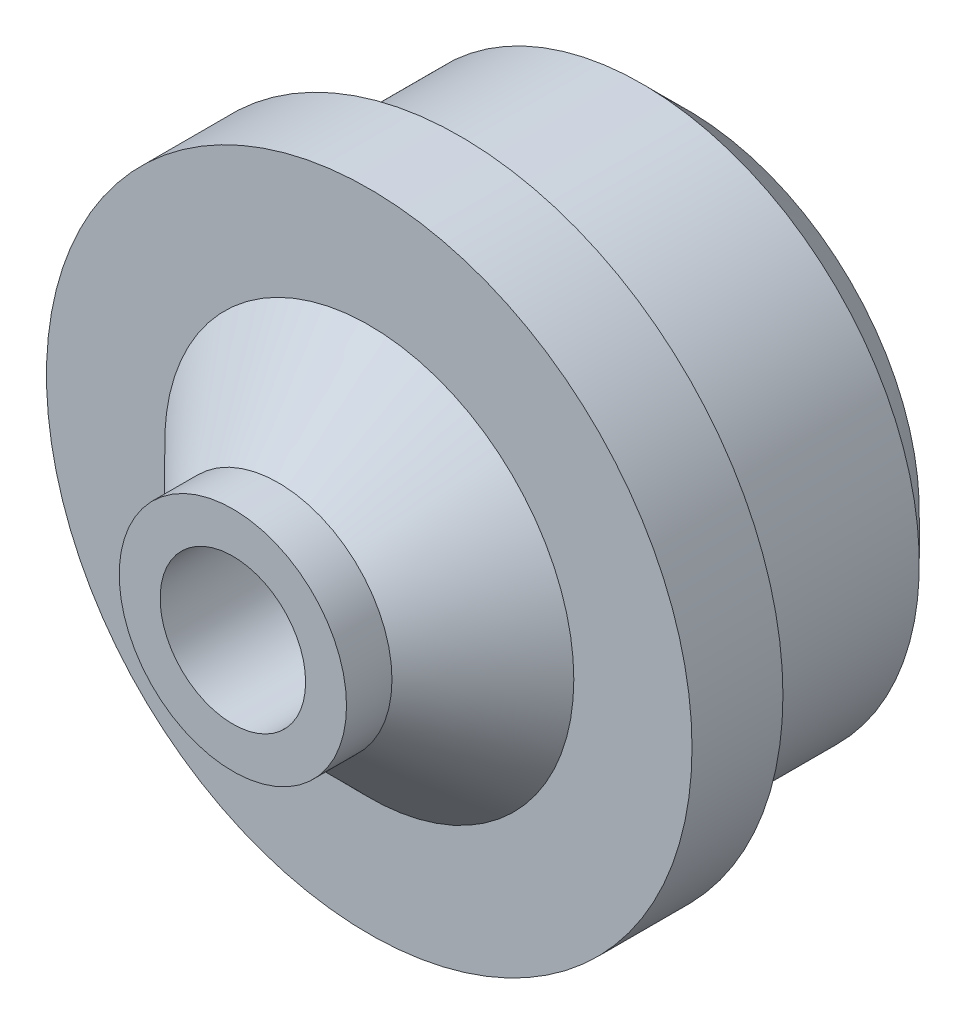
ISO-10303-21;
HEADER;
FILE_DESCRIPTION(('STEP AP214'),'2;1');
FILE_NAME('part.step','',(''),(''),'','','');
FILE_SCHEMA(('AUTOMOTIVE_DESIGN { 1 0 10303 214 1 1 1 1 }'));
ENDSEC;
DATA;
#1=APPLICATION_CONTEXT('core data for automotive mechanical design processes');
#2=APPLICATION_PROTOCOL_DEFINITION('international standard','automotive_design',2000,#1);
#3=PRODUCT_CONTEXT('',#1,'mechanical');
#4=PRODUCT('Part','Part','',(#3));
#5=PRODUCT_RELATED_PRODUCT_CATEGORY('part','',(#4));
#6=PRODUCT_DEFINITION_FORMATION('','',#4);
#7=PRODUCT_DEFINITION_CONTEXT('part definition',#1,'design');
#8=PRODUCT_DEFINITION('design','',#6,#7);
#9=PRODUCT_DEFINITION_SHAPE('','',#8);
#10=(LENGTH_UNIT() NAMED_UNIT(*) SI_UNIT(.MILLI.,.METRE.));
#11=(NAMED_UNIT(*) PLANE_ANGLE_UNIT() SI_UNIT($,.RADIAN.));
#12=(NAMED_UNIT(*) SI_UNIT($,.STERADIAN.) SOLID_ANGLE_UNIT());
#13=UNCERTAINTY_MEASURE_WITH_UNIT(LENGTH_MEASURE(1.E-05),#10,'distance_accuracy_value','');
#14=(GEOMETRIC_REPRESENTATION_CONTEXT(3) GLOBAL_UNCERTAINTY_ASSIGNED_CONTEXT((#13)) GLOBAL_UNIT_ASSIGNED_CONTEXT((#10,
#11,#12)) REPRESENTATION_CONTEXT('',''));
#15=CARTESIAN_POINT('',(0.,0.,0.));
#16=DIRECTION('',(0.,0.,1.));
#17=DIRECTION('',(1.,0.,0.));
#18=AXIS2_PLACEMENT_3D('',#15,#16,#17);
#19=CARTESIAN_POINT('',(0.,-0.874999999999985,-5.));
#20=DIRECTION('',(0.,-1.,0.));
#21=DIRECTION('',(1.,0.,0.));
#22=AXIS2_PLACEMENT_3D('',#19,#20,#21);
#23=PLANE('',#22);
#24=DIRECTION('',(1.,0.,0.));
#25=VECTOR('',#24,1.);
#26=CARTESIAN_POINT('',(0.,-0.874999999999985,0.));
#27=LINE('',#26,#25);
#28=CARTESIAN_POINT('',(-6.35,-0.875,0.));
#29=VERTEX_POINT('',#28);
#30=CARTESIAN_POINT('',(-6.03691767378022,-0.874999999999999,0.));
#31=VERTEX_POINT('',#30);
#32=EDGE_CURVE('E98',#29,#31,#27,.T.);
#33=ORIENTED_EDGE('',*,*,#32,.F.);
#34=DIRECTION('',(0.,0.,1.));
#35=VECTOR('',#34,1.);
#36=CARTESIAN_POINT('',(-6.35,-0.875,-5.));
#37=LINE('',#36,#35);
#38=CARTESIAN_POINT('',(-6.35,-0.875,-5.));
#39=VERTEX_POINT('',#38);
#40=EDGE_CURVE('E100',#39,#29,#37,.T.);
#41=ORIENTED_EDGE('',*,*,#40,.F.);
#42=DIRECTION('',(1.,0.,0.));
#43=VECTOR('',#42,1.);
#44=CARTESIAN_POINT('',(0.,-0.874999999999985,-5.));
#45=LINE('',#44,#43);
#46=CARTESIAN_POINT('',(-5.0243780709656,-0.874999999999997,-5.));
#47=VERTEX_POINT('',#46);
#48=EDGE_CURVE('E75',#39,#47,#45,.T.);
#49=ORIENTED_EDGE('',*,*,#48,.T.);
#50=CARTESIAN_POINT('',(-5.0243780709656,-0.874999999999997,-5.));
#51=CARTESIAN_POINT('',(-5.19332243294403,-0.874999999999997,-4.83352343973465));
#52=CARTESIAN_POINT('',(-5.36217291655565,-0.874999999999998,-4.66695182390504));
#53=CARTESIAN_POINT('',(-5.69968611748322,-0.874999999999998,-4.33361849056093));
#54=CARTESIAN_POINT('',(-5.86834883480981,-0.874999999999999,-4.16685677305721));
#55=CARTESIAN_POINT('',(-6.03691767378022,-0.874999999999999,-4.));
#56=B_SPLINE_CURVE_WITH_KNOTS('',3,(#50,#51,#52,#53,#54,#55),.UNSPECIFIED.,.F.,.F.,(4,2,4),(0.,
0.711554144913555,1.4231082495093),.UNSPECIFIED.);
#57=CARTESIAN_POINT('',(-6.03691767378022,-0.874999999999999,-4.));
#58=VERTEX_POINT('',#57);
#59=EDGE_CURVE('E12',#47,#58,#56,.T.);
#60=ORIENTED_EDGE('',*,*,#59,.T.);
#61=DIRECTION('',(0.,0.,1.));
#62=VECTOR('',#61,1.);
#63=CARTESIAN_POINT('',(-6.03691767378022,-0.874999999999999,-5.));
#64=LINE('',#63,#62);
#65=EDGE_CURVE('E102',#58,#31,#64,.T.);
#66=ORIENTED_EDGE('',*,*,#65,.T.);
#67=EDGE_LOOP('',(#33,#41,#49,#60,#66));
#68=FACE_BOUND('',#67,.T.);
#69=ADVANCED_FACE('F50',(#68),#23,.T.);
#70=CARTESIAN_POINT('',(-6.35,0.,-5.));
#71=DIRECTION('',(-1.,0.,0.));
#72=DIRECTION('',(0.,0.,1.));
#73=AXIS2_PLACEMENT_3D('',#70,#71,#72);
#74=PLANE('',#73);
#75=DIRECTION('',(0.,-1.,0.));
#76=VECTOR('',#75,1.);
#77=CARTESIAN_POINT('',(-6.35,0.,0.));
#78=LINE('',#77,#76);
#79=CARTESIAN_POINT('',(-6.35,0.875,0.));
#80=VERTEX_POINT('',#79);
#81=EDGE_CURVE('E115',#80,#29,#78,.T.);
#82=ORIENTED_EDGE('',*,*,#81,.F.);
#83=DIRECTION('',(0.,0.,1.));
#84=VECTOR('',#83,1.);
#85=CARTESIAN_POINT('',(-6.35,0.875,-5.));
#86=LINE('',#85,#84);
#87=CARTESIAN_POINT('',(-6.35,0.875,-5.));
#88=VERTEX_POINT('',#87);
#89=EDGE_CURVE('E120',#88,#80,#86,.T.);
#90=ORIENTED_EDGE('',*,*,#89,.F.);
#91=DIRECTION('',(0.,-1.,0.));
#92=VECTOR('',#91,1.);
#93=CARTESIAN_POINT('',(-6.35,0.,-5.));
#94=LINE('',#93,#92);
#95=EDGE_CURVE('E117',#88,#39,#94,.T.);
#96=ORIENTED_EDGE('',*,*,#95,.T.);
#97=ORIENTED_EDGE('',*,*,#40,.T.);
#98=EDGE_LOOP('',(#82,#90,#96,#97));
#99=FACE_BOUND('',#98,.T.);
#100=ADVANCED_FACE('F114',(#99),#74,.T.);
#101=CARTESIAN_POINT('',(0.,0.875,-5.));
#102=DIRECTION('',(0.,1.,0.));
#103=DIRECTION('',(0.,0.,1.));
#104=AXIS2_PLACEMENT_3D('',#101,#102,#103);
#105=PLANE('',#104);
#106=DIRECTION('',(-1.,0.,0.));
#107=VECTOR('',#106,1.);
#108=CARTESIAN_POINT('',(0.,0.875,0.));
#109=LINE('',#108,#107);
#110=CARTESIAN_POINT('',(-6.03691767378022,0.875,0.));
#111=VERTEX_POINT('',#110);
#112=EDGE_CURVE('E124',#111,#80,#109,.T.);
#113=ORIENTED_EDGE('',*,*,#112,.F.);
#114=DIRECTION('',(0.,0.,1.));
#115=VECTOR('',#114,1.);
#116=CARTESIAN_POINT('',(-6.03691767378022,0.875,-5.));
#117=LINE('',#116,#115);
#118=CARTESIAN_POINT('',(-6.03691767378022,0.875,-4.));
#119=VERTEX_POINT('',#118);
#120=EDGE_CURVE('E135',#119,#111,#117,.T.);
#121=ORIENTED_EDGE('',*,*,#120,.F.);
#122=CARTESIAN_POINT('',(-6.03691767378022,0.875,-4.));
#123=CARTESIAN_POINT('',(-5.86834883480981,0.875,-4.16685677305721));
#124=CARTESIAN_POINT('',(-5.69968611748322,0.875,-4.33361849056093));
#125=CARTESIAN_POINT('',(-5.36217291655565,0.875,-4.66695182390504));
#126=CARTESIAN_POINT('',(-5.19332243294403,0.875,-4.83352343973465));
#127=CARTESIAN_POINT('',(-5.02437807096559,0.875,-5.));
#128=B_SPLINE_CURVE_WITH_KNOTS('',3,(#122,#123,#124,#125,#126,#127),.UNSPECIFIED.,.F.,.F.,(4,2,
4),(0.,0.711554104595742,1.4231082495093),.UNSPECIFIED.);
#129=CARTESIAN_POINT('',(-5.02437807096559,0.875,-5.));
#130=VERTEX_POINT('',#129);
#131=EDGE_CURVE('E60',#119,#130,#128,.T.);
#132=ORIENTED_EDGE('',*,*,#131,.T.);
#133=DIRECTION('',(-1.,0.,0.));
#134=VECTOR('',#133,1.);
#135=CARTESIAN_POINT('',(0.,0.875,-5.));
#136=LINE('',#135,#134);
#137=EDGE_CURVE('E68',#130,#88,#136,.T.);
#138=ORIENTED_EDGE('',*,*,#137,.T.);
#139=ORIENTED_EDGE('',*,*,#89,.T.);
#140=EDGE_LOOP('',(#113,#121,#132,#138,#139));
#141=FACE_BOUND('',#140,.T.);
#142=ADVANCED_FACE('F169',(#141),#105,.T.);
#143=CARTESIAN_POINT('',(0.,0.,-5.));
#144=DIRECTION('',(0.,0.,1.));
#145=DIRECTION('',(1.,0.,0.));
#146=AXIS2_PLACEMENT_3D('',#143,#144,#145);
#147=CYLINDRICAL_SURFACE('',#146,6.1);
#148=ORIENTED_EDGE('',*,*,#65,.F.);
#149=CARTESIAN_POINT('',(0.,0.,-4.));
#150=DIRECTION('',(0.,0.,1.));
#151=DIRECTION('',(1.,0.,0.));
#152=AXIS2_PLACEMENT_3D('',#149,#150,#151);
#153=CIRCLE('',#152,6.1);
#154=EDGE_CURVE('E147',#58,#119,#153,.T.);
#155=ORIENTED_EDGE('',*,*,#154,.T.);
#156=ORIENTED_EDGE('',*,*,#120,.T.);
#157=CARTESIAN_POINT('',(0.,0.,0.));
#158=DIRECTION('',(0.,0.,1.));
#159=DIRECTION('',(1.,0.,0.));
#160=AXIS2_PLACEMENT_3D('',#157,#158,#159);
#161=CIRCLE('',#160,6.1);
#162=EDGE_CURVE('E108',#31,#111,#161,.T.);
#163=ORIENTED_EDGE('',*,*,#162,.F.);
#164=EDGE_LOOP('',(#148,#155,#156,#163));
#165=FACE_BOUND('',#164,.T.);
#166=ADVANCED_FACE('F174',(#165),#147,.T.);
#167=CARTESIAN_POINT('',(0.,0.,-5.));
#168=DIRECTION('',(0.,0.,1.));
#169=DIRECTION('',(1.,0.,0.));
#170=AXIS2_PLACEMENT_3D('',#167,#168,#169);
#171=PLANE('',#170);
#172=CARTESIAN_POINT('',(0.,0.,-5.));
#173=DIRECTION('',(0.,0.,1.));
#174=DIRECTION('',(1.,0.,0.));
#175=AXIS2_PLACEMENT_3D('',#172,#173,#174);
#176=CIRCLE('',#175,1.6);
#177=CARTESIAN_POINT('',(1.6,0.,-5.));
#178=VERTEX_POINT('',#177);
#179=EDGE_CURVE('E211',#178,#178,#176,.T.);
#180=ORIENTED_EDGE('',*,*,#179,.T.);
#181=EDGE_LOOP('',(#180));
#182=FACE_BOUND('',#181,.T.);
#183=ORIENTED_EDGE('',*,*,#137,.F.);
#184=CARTESIAN_POINT('',(0.,0.,-5.));
#185=DIRECTION('',(0.,0.,1.));
#186=DIRECTION('',(1.,0.,0.));
#187=AXIS2_PLACEMENT_3D('',#184,#185,#186);
#188=CIRCLE('',#187,5.1);
#189=EDGE_CURVE('E151',#130,#47,#188,.F.);
#190=ORIENTED_EDGE('',*,*,#189,.T.);
#191=ORIENTED_EDGE('',*,*,#48,.F.);
#192=ORIENTED_EDGE('',*,*,#95,.F.);
#193=EDGE_LOOP('',(#183,#190,#191,#192));
#194=FACE_BOUND('',#193,.T.);
#195=ADVANCED_FACE('F178',(#182,#194),#171,.F.);
#196=CARTESIAN_POINT('',(0.,0.,0.));
#197=DIRECTION('',(0.,0.,1.));
#198=DIRECTION('',(1.,0.,0.));
#199=AXIS2_PLACEMENT_3D('',#196,#197,#198);
#200=PLANE('',#199);
#201=CARTESIAN_POINT('',(0.,0.,0.));
#202=DIRECTION('',(0.,0.,1.));
#203=DIRECTION('',(1.,0.,0.));
#204=AXIS2_PLACEMENT_3D('',#201,#202,#203);
#205=CIRCLE('',#204,7.1);
#206=CARTESIAN_POINT('',(7.1,0.,0.));
#207=VERTEX_POINT('',#206);
#208=EDGE_CURVE('E210',#207,#207,#205,.T.);
#209=ORIENTED_EDGE('',*,*,#208,.F.);
#210=EDGE_LOOP('',(#209));
#211=FACE_BOUND('',#210,.T.);
#212=ORIENTED_EDGE('',*,*,#81,.T.);
#213=ORIENTED_EDGE('',*,*,#32,.T.);
#214=ORIENTED_EDGE('',*,*,#162,.T.);
#215=ORIENTED_EDGE('',*,*,#112,.T.);
#216=EDGE_LOOP('',(#212,#213,#214,#215));
#217=FACE_BOUND('',#216,.T.);
#218=ADVANCED_FACE('F122',(#211,#217),#200,.F.);
#219=CARTESIAN_POINT('',(0.,0.,2.));
#220=DIRECTION('',(0.,0.,-1.));
#221=DIRECTION('',(-1.,0.,0.));
#222=AXIS2_PLACEMENT_3D('',#219,#220,#221);
#223=CYLINDRICAL_SURFACE('',#222,7.1);
#224=CARTESIAN_POINT('',(0.,0.,2.));
#225=DIRECTION('',(0.,0.,1.));
#226=DIRECTION('',(1.,0.,0.));
#227=AXIS2_PLACEMENT_3D('',#224,#225,#226);
#228=CIRCLE('',#227,7.1);
#229=CARTESIAN_POINT('',(7.1,0.,2.));
#230=VERTEX_POINT('',#229);
#231=EDGE_CURVE('E109',#230,#230,#228,.T.);
#232=ORIENTED_EDGE('',*,*,#231,.F.);
#233=EDGE_LOOP('',(#232));
#234=FACE_BOUND('',#233,.T.);
#235=ORIENTED_EDGE('',*,*,#208,.T.);
#236=EDGE_LOOP('',(#235));
#237=FACE_BOUND('',#236,.T.);
#238=ADVANCED_FACE('F262',(#234,#237),#223,.T.);
#239=CARTESIAN_POINT('',(0.,0.,2.));
#240=DIRECTION('',(0.,0.,1.));
#241=DIRECTION('',(1.,0.,0.));
#242=AXIS2_PLACEMENT_3D('',#239,#240,#241);
#243=PLANE('',#242);
#244=CARTESIAN_POINT('',(0.,0.,2.));
#245=DIRECTION('',(0.,0.,1.));
#246=DIRECTION('',(1.,0.,0.));
#247=AXIS2_PLACEMENT_3D('',#244,#245,#246);
#248=CIRCLE('',#247,4.5);
#249=CARTESIAN_POINT('',(4.5,0.,2.));
#250=VERTEX_POINT('',#249);
#251=EDGE_CURVE('E143',#250,#250,#248,.F.);
#252=ORIENTED_EDGE('',*,*,#251,.T.);
#253=EDGE_LOOP('',(#252));
#254=FACE_BOUND('',#253,.T.);
#255=ORIENTED_EDGE('',*,*,#231,.T.);
#256=EDGE_LOOP('',(#255));
#257=FACE_BOUND('',#256,.T.);
#258=ADVANCED_FACE('F204',(#254,#257),#243,.T.);
#259=CARTESIAN_POINT('',(0.,0.,9.));
#260=DIRECTION('',(0.,0.,-1.));
#261=DIRECTION('',(-1.,0.,0.));
#262=AXIS2_PLACEMENT_3D('',#259,#260,#261);
#263=CYLINDRICAL_SURFACE('',#262,2.5);
#264=CARTESIAN_POINT('',(0.,0.,4.00000000000002));
#265=DIRECTION('',(0.,0.,1.));
#266=DIRECTION('',(1.,0.,0.));
#267=AXIS2_PLACEMENT_3D('',#264,#265,#266);
#268=CIRCLE('',#267,2.5);
#269=CARTESIAN_POINT('',(2.5,0.,4.00000000000002));
#270=VERTEX_POINT('',#269);
#271=EDGE_CURVE('E119',#270,#270,#268,.T.);
#272=ORIENTED_EDGE('',*,*,#271,.T.);
#273=EDGE_LOOP('',(#272));
#274=FACE_BOUND('',#273,.T.);
#275=CARTESIAN_POINT('',(0.,0.,5.));
#276=DIRECTION('',(0.,0.,1.));
#277=DIRECTION('',(1.,0.,0.));
#278=AXIS2_PLACEMENT_3D('',#275,#276,#277);
#279=CIRCLE('',#278,2.5);
#280=CARTESIAN_POINT('',(2.5,0.,5.));
#281=VERTEX_POINT('',#280);
#282=EDGE_CURVE('E54',#281,#281,#279,.T.);
#283=ORIENTED_EDGE('',*,*,#282,.F.);
#284=EDGE_LOOP('',(#283));
#285=FACE_BOUND('',#284,.T.);
#286=ADVANCED_FACE('F196',(#274,#285),#263,.T.);
#287=CARTESIAN_POINT('',(0.,0.,5.));
#288=DIRECTION('',(0.,0.,1.));
#289=DIRECTION('',(1.,0.,0.));
#290=AXIS2_PLACEMENT_3D('',#287,#288,#289);
#291=PLANE('',#290);
#292=CARTESIAN_POINT('',(0.,0.,5.));
#293=DIRECTION('',(0.,0.,1.));
#294=DIRECTION('',(1.,0.,0.));
#295=AXIS2_PLACEMENT_3D('',#292,#293,#294);
#296=CIRCLE('',#295,1.6);
#297=CARTESIAN_POINT('',(1.6,0.,5.));
#298=VERTEX_POINT('',#297);
#299=EDGE_CURVE('E217',#298,#298,#296,.T.);
#300=ORIENTED_EDGE('',*,*,#299,.F.);
#301=EDGE_LOOP('',(#300));
#302=FACE_BOUND('',#301,.T.);
#303=ORIENTED_EDGE('',*,*,#282,.T.);
#304=EDGE_LOOP('',(#303));
#305=FACE_BOUND('',#304,.T.);
#306=ADVANCED_FACE('F52',(#302,#305),#291,.T.);
#307=CARTESIAN_POINT('',(0.,0.,4.00000000000002));
#308=DIRECTION('',(0.,0.,-1.));
#309=DIRECTION('',(-1.,0.,0.));
#310=AXIS2_PLACEMENT_3D('',#307,#308,#309);
#311=CONICAL_SURFACE('',#310,2.5,0.785398163397444);
#312=ORIENTED_EDGE('',*,*,#251,.F.);
#313=EDGE_LOOP('',(#312));
#314=FACE_BOUND('',#313,.T.);
#315=ORIENTED_EDGE('',*,*,#271,.F.);
#316=EDGE_LOOP('',(#315));
#317=FACE_BOUND('',#316,.T.);
#318=ADVANCED_FACE('F183',(#314,#317),#311,.T.);
#319=CARTESIAN_POINT('',(0.,0.,-21.));
#320=DIRECTION('',(0.,0.,1.));
#321=DIRECTION('',(1.,0.,0.));
#322=AXIS2_PLACEMENT_3D('',#319,#320,#321);
#323=CYLINDRICAL_SURFACE('',#322,1.6);
#324=ORIENTED_EDGE('',*,*,#299,.T.);
#325=EDGE_LOOP('',(#324));
#326=FACE_BOUND('',#325,.T.);
#327=ORIENTED_EDGE('',*,*,#179,.F.);
#328=EDGE_LOOP('',(#327));
#329=FACE_BOUND('',#328,.T.);
#330=ADVANCED_FACE('F187',(#326,#329),#323,.F.);
#331=CARTESIAN_POINT('',(0.,0.,-4.));
#332=DIRECTION('',(0.,0.,1.));
#333=DIRECTION('',(1.,0.,0.));
#334=AXIS2_PLACEMENT_3D('',#331,#332,#333);
#335=CONICAL_SURFACE('',#334,6.1,0.78539816339745);
#336=ORIENTED_EDGE('',*,*,#59,.F.);
#337=ORIENTED_EDGE('',*,*,#189,.F.);
#338=ORIENTED_EDGE('',*,*,#131,.F.);
#339=ORIENTED_EDGE('',*,*,#154,.F.);
#340=EDGE_LOOP('',(#336,#337,#338,#339));
#341=FACE_BOUND('',#340,.T.);
#342=ADVANCED_FACE('F166',(#341),#335,.T.);
#343=CLOSED_SHELL('',(#69,#100,#142,#166,#195,#218,#238,#258,#286,#306,#318,#330,#342));
#344=MANIFOLD_SOLID_BREP('B2',#343);
#345=ADVANCED_BREP_SHAPE_REPRESENTATION('',(#18,#344),#14);
#346=SHAPE_DEFINITION_REPRESENTATION(#9,#345);
ENDSEC;
END-ISO-10303-21;
